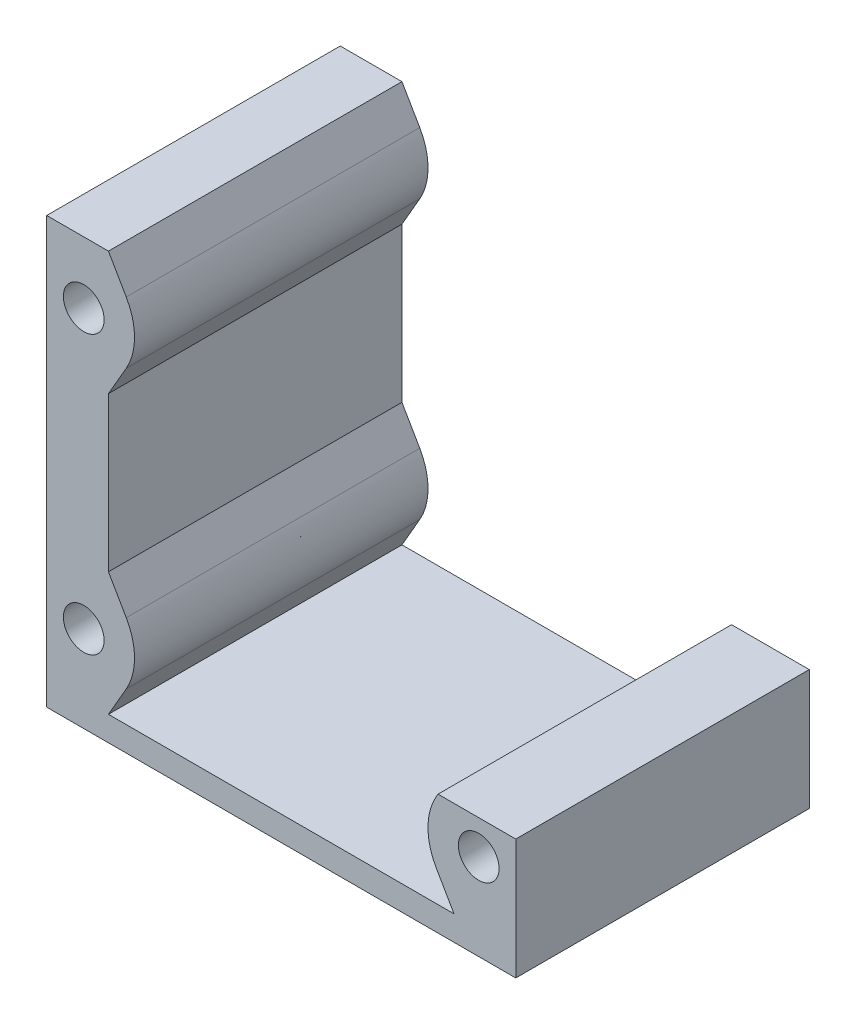
ISO-10303-21;
HEADER;
FILE_DESCRIPTION(('STEP AP214'),'2;1');
FILE_NAME('part.step','',(''),(''),'','','');
FILE_SCHEMA(('AUTOMOTIVE_DESIGN { 1 0 10303 214 1 1 1 1 }'));
ENDSEC;
DATA;
#1=APPLICATION_CONTEXT('core data for automotive mechanical design processes');
#2=APPLICATION_PROTOCOL_DEFINITION('international standard','automotive_design',2000,#1);
#3=PRODUCT_CONTEXT('',#1,'mechanical');
#4=PRODUCT('Part','Part','',(#3));
#5=PRODUCT_RELATED_PRODUCT_CATEGORY('part','',(#4));
#6=PRODUCT_DEFINITION_FORMATION('','',#4);
#7=PRODUCT_DEFINITION_CONTEXT('part definition',#1,'design');
#8=PRODUCT_DEFINITION('design','',#6,#7);
#9=PRODUCT_DEFINITION_SHAPE('','',#8);
#10=(LENGTH_UNIT() NAMED_UNIT(*) SI_UNIT(.MILLI.,.METRE.));
#11=(NAMED_UNIT(*) PLANE_ANGLE_UNIT() SI_UNIT($,.RADIAN.));
#12=(NAMED_UNIT(*) SI_UNIT($,.STERADIAN.) SOLID_ANGLE_UNIT());
#13=UNCERTAINTY_MEASURE_WITH_UNIT(LENGTH_MEASURE(1.E-05),#10,'distance_accuracy_value','');
#14=(GEOMETRIC_REPRESENTATION_CONTEXT(3) GLOBAL_UNCERTAINTY_ASSIGNED_CONTEXT((#13)) GLOBAL_UNIT_ASSIGNED_CONTEXT((#10,
#11,#12)) REPRESENTATION_CONTEXT('',''));
#15=CARTESIAN_POINT('',(0.,0.,0.));
#16=DIRECTION('',(0.,0.,1.));
#17=DIRECTION('',(1.,0.,0.));
#18=AXIS2_PLACEMENT_3D('',#15,#16,#17);
#19=CARTESIAN_POINT('',(85.7252959413938,-3.99999999999999,70.0573745353297));
#20=DIRECTION('',(0.,0.,1.));
#21=DIRECTION('',(1.,0.,0.));
#22=AXIS2_PLACEMENT_3D('',#19,#20,#21);
#23=PLANE('',#22);
#24=CARTESIAN_POINT('',(32.,10.,70.0573745353297));
#25=DIRECTION('',(0.,0.,1.));
#26=DIRECTION('',(1.,0.,0.));
#27=AXIS2_PLACEMENT_3D('',#24,#25,#26);
#28=CIRCLE('',#27,3.3);
#29=CARTESIAN_POINT('',(35.3,10.,70.0573745353297));
#30=VERTEX_POINT('',#29);
#31=EDGE_CURVE('E173',#30,#30,#28,.F.);
#32=ORIENTED_EDGE('',*,*,#31,.T.);
#33=EDGE_LOOP('',(#32));
#34=FACE_BOUND('',#33,.T.);
#35=CARTESIAN_POINT('',(-32.,55.,70.0573745353297));
#36=DIRECTION('',(0.,0.,1.));
#37=DIRECTION('',(1.,0.,0.));
#38=AXIS2_PLACEMENT_3D('',#35,#36,#37);
#39=CIRCLE('',#38,3.3);
#40=CARTESIAN_POINT('',(-28.7,55.,70.0573745353297));
#41=VERTEX_POINT('',#40);
#42=EDGE_CURVE('E169',#41,#41,#39,.F.);
#43=ORIENTED_EDGE('',*,*,#42,.T.);
#44=EDGE_LOOP('',(#43));
#45=FACE_BOUND('',#44,.T.);
#46=CARTESIAN_POINT('',(-32.,10.,70.0573745353297));
#47=DIRECTION('',(0.,0.,1.));
#48=DIRECTION('',(1.,0.,0.));
#49=AXIS2_PLACEMENT_3D('',#46,#47,#48);
#50=CIRCLE('',#49,3.3);
#51=CARTESIAN_POINT('',(-28.7,10.,70.0573745353297));
#52=VERTEX_POINT('',#51);
#53=EDGE_CURVE('E172',#52,#52,#50,.F.);
#54=ORIENTED_EDGE('',*,*,#53,.T.);
#55=EDGE_LOOP('',(#54));
#56=FACE_BOUND('',#55,.T.);
#57=DIRECTION('',(0.,-1.,0.));
#58=VECTOR('',#57,1.);
#59=CARTESIAN_POINT('',(38.,-3.99999999999999,70.0573745353297));
#60=LINE('',#59,#58);
#61=CARTESIAN_POINT('',(38.,15.5,70.0573745353297));
#62=VERTEX_POINT('',#61);
#63=CARTESIAN_POINT('',(38.,-3.99999999999999,70.0573745353297));
#64=VERTEX_POINT('',#63);
#65=EDGE_CURVE('E155',#62,#64,#60,.T.);
#66=ORIENTED_EDGE('',*,*,#65,.F.);
#67=DIRECTION('',(1.,0.,0.));
#68=VECTOR('',#67,1.);
#69=CARTESIAN_POINT('',(7.99999999999999,15.5,70.0573745353297));
#70=LINE('',#69,#68);
#71=CARTESIAN_POINT('',(25.4019237886467,15.5,70.0573745353297));
#72=VERTEX_POINT('',#71);
#73=EDGE_CURVE('E11',#72,#62,#70,.T.);
#74=ORIENTED_EDGE('',*,*,#73,.F.);
#75=DIRECTION('',(-0.5,-0.866025403784439,0.));
#76=VECTOR('',#75,1.);
#77=CARTESIAN_POINT('',(22.2264973081037,9.99999999999999,70.0573745353297));
#78=LINE('',#77,#76);
#79=CARTESIAN_POINT('',(25.1132486540519,15.,70.0573745353297));
#80=VERTEX_POINT('',#79);
#81=EDGE_CURVE('E188',#72,#80,#78,.T.);
#82=ORIENTED_EDGE('',*,*,#81,.T.);
#83=CARTESIAN_POINT('',(33.7735026918963,10.,70.0573745353297));
#84=DIRECTION('',(0.,0.,1.));
#85=DIRECTION('',(1.,0.,0.));
#86=AXIS2_PLACEMENT_3D('',#83,#84,#85);
#87=CIRCLE('',#86,10.);
#88=CARTESIAN_POINT('',(25.1132486540519,5.,70.0573745353297));
#89=VERTEX_POINT('',#88);
#90=EDGE_CURVE('E195',#80,#89,#87,.T.);
#91=ORIENTED_EDGE('',*,*,#90,.T.);
#92=DIRECTION('',(0.5,-0.866025403784438,0.));
#93=VECTOR('',#92,1.);
#94=CARTESIAN_POINT('',(28.,0.,70.0573745353297));
#95=LINE('',#94,#93);
#96=CARTESIAN_POINT('',(28.,0.,70.0573745353298));
#97=VERTEX_POINT('',#96);
#98=EDGE_CURVE('E196',#89,#97,#95,.T.);
#99=ORIENTED_EDGE('',*,*,#98,.T.);
#100=DIRECTION('',(-1.,0.,0.));
#101=VECTOR('',#100,1.);
#102=CARTESIAN_POINT('',(85.7252959413938,0.,70.0573745353297));
#103=LINE('',#102,#101);
#104=CARTESIAN_POINT('',(-28.,0.,70.0573745353297));
#105=VERTEX_POINT('',#104);
#106=EDGE_CURVE('E198',#97,#105,#103,.T.);
#107=ORIENTED_EDGE('',*,*,#106,.T.);
#108=DIRECTION('',(0.5,0.866025403784438,0.));
#109=VECTOR('',#108,1.);
#110=CARTESIAN_POINT('',(-28.,0.,70.0573745353298));
#111=LINE('',#110,#109);
#112=CARTESIAN_POINT('',(-25.1132486540519,5.,70.0573745353298));
#113=VERTEX_POINT('',#112);
#114=EDGE_CURVE('E235',#105,#113,#111,.T.);
#115=ORIENTED_EDGE('',*,*,#114,.T.);
#116=CARTESIAN_POINT('',(-33.7735026918963,10.,70.0573745353297));
#117=DIRECTION('',(0.,0.,1.));
#118=DIRECTION('',(1.,0.,0.));
#119=AXIS2_PLACEMENT_3D('',#116,#117,#118);
#120=CIRCLE('',#119,10.);
#121=CARTESIAN_POINT('',(-25.1132486540519,15.,70.0573745353297));
#122=VERTEX_POINT('',#121);
#123=EDGE_CURVE('E234',#113,#122,#120,.T.);
#124=ORIENTED_EDGE('',*,*,#123,.T.);
#125=DIRECTION('',(-0.5,0.866025403784439,0.));
#126=VECTOR('',#125,1.);
#127=CARTESIAN_POINT('',(-22.2264973081037,9.99999999999999,70.0573745353297));
#128=LINE('',#127,#126);
#129=CARTESIAN_POINT('',(-28.,20.,70.0573745353297));
#130=VERTEX_POINT('',#129);
#131=EDGE_CURVE('E232',#122,#130,#128,.T.);
#132=ORIENTED_EDGE('',*,*,#131,.T.);
#133=DIRECTION('',(0.,1.,0.));
#134=VECTOR('',#133,1.);
#135=CARTESIAN_POINT('',(-28.,20.,70.0573745353297));
#136=LINE('',#135,#134);
#137=CARTESIAN_POINT('',(-28.,45.,70.0573745353297));
#138=VERTEX_POINT('',#137);
#139=EDGE_CURVE('E229',#130,#138,#136,.T.);
#140=ORIENTED_EDGE('',*,*,#139,.T.);
#141=DIRECTION('',(0.5,0.866025403784439,0.));
#142=VECTOR('',#141,1.);
#143=CARTESIAN_POINT('',(-28.,45.,70.0573745353297));
#144=LINE('',#143,#142);
#145=CARTESIAN_POINT('',(-25.1132486540519,50.,70.0573745353297));
#146=VERTEX_POINT('',#145);
#147=EDGE_CURVE('E225',#138,#146,#144,.T.);
#148=ORIENTED_EDGE('',*,*,#147,.T.);
#149=CARTESIAN_POINT('',(-33.7735026918963,55.,70.0573745353297));
#150=DIRECTION('',(0.,0.,1.));
#151=DIRECTION('',(1.,0.,0.));
#152=AXIS2_PLACEMENT_3D('',#149,#150,#151);
#153=CIRCLE('',#152,10.);
#154=CARTESIAN_POINT('',(-25.1132486540519,60.,70.0573745353297));
#155=VERTEX_POINT('',#154);
#156=EDGE_CURVE('E228',#146,#155,#153,.T.);
#157=ORIENTED_EDGE('',*,*,#156,.T.);
#158=DIRECTION('',(-0.5,0.866025403784439,0.));
#159=VECTOR('',#158,1.);
#160=CARTESIAN_POINT('',(-22.2264973081037,55.,70.0573745353297));
#161=LINE('',#160,#159);
#162=CARTESIAN_POINT('',(-28.,65.,70.0573745353297));
#163=VERTEX_POINT('',#162);
#164=EDGE_CURVE('E240',#155,#163,#161,.T.);
#165=ORIENTED_EDGE('',*,*,#164,.T.);
#166=DIRECTION('',(-1.,0.,0.));
#167=VECTOR('',#166,1.);
#168=CARTESIAN_POINT('',(-28.,65.,70.0573745353297));
#169=LINE('',#168,#167);
#170=CARTESIAN_POINT('',(-38.,65.,70.0573745353297));
#171=VERTEX_POINT('',#170);
#172=EDGE_CURVE('E168',#163,#171,#169,.T.);
#173=ORIENTED_EDGE('',*,*,#172,.T.);
#174=DIRECTION('',(0.,1.,0.));
#175=VECTOR('',#174,1.);
#176=CARTESIAN_POINT('',(-38.,-3.99999999999999,70.0573745353297));
#177=LINE('',#176,#175);
#178=CARTESIAN_POINT('',(-38.,-3.99999999999999,70.0573745353297));
#179=VERTEX_POINT('',#178);
#180=EDGE_CURVE('E246',#179,#171,#177,.T.);
#181=ORIENTED_EDGE('',*,*,#180,.F.);
#182=DIRECTION('',(-1.,0.,0.));
#183=VECTOR('',#182,1.);
#184=CARTESIAN_POINT('',(85.7252959413938,-3.99999999999999,70.0573745353297));
#185=LINE('',#184,#183);
#186=EDGE_CURVE('E162',#64,#179,#185,.T.);
#187=ORIENTED_EDGE('',*,*,#186,.F.);
#188=EDGE_LOOP('',(#66,#74,#82,#91,#99,#107,#115,#124,#132,#140,#148,#157,#165,#173,#181,#187));
#189=FACE_BOUND('',#188,.T.);
#190=ADVANCED_FACE('F39',(#34,#45,#56,#189),#23,.T.);
#191=CARTESIAN_POINT('',(85.7252959413938,-4.,22.5));
#192=DIRECTION('',(0.,0.,-1.));
#193=DIRECTION('',(-1.,0.,0.));
#194=AXIS2_PLACEMENT_3D('',#191,#192,#193);
#195=PLANE('',#194);
#196=CARTESIAN_POINT('',(32.,10.,22.5));
#197=DIRECTION('',(0.,0.,-1.));
#198=DIRECTION('',(-1.,0.,0.));
#199=AXIS2_PLACEMENT_3D('',#196,#197,#198);
#200=CIRCLE('',#199,3.3);
#201=CARTESIAN_POINT('',(28.7,10.,22.5));
#202=VERTEX_POINT('',#201);
#203=EDGE_CURVE('E177',#202,#202,#200,.T.);
#204=ORIENTED_EDGE('',*,*,#203,.F.);
#205=EDGE_LOOP('',(#204));
#206=FACE_BOUND('',#205,.T.);
#207=CARTESIAN_POINT('',(-32.,55.,22.5));
#208=DIRECTION('',(0.,0.,-1.));
#209=DIRECTION('',(-1.,0.,0.));
#210=AXIS2_PLACEMENT_3D('',#207,#208,#209);
#211=CIRCLE('',#210,3.3);
#212=CARTESIAN_POINT('',(-35.3,55.,22.5));
#213=VERTEX_POINT('',#212);
#214=EDGE_CURVE('E174',#213,#213,#211,.T.);
#215=ORIENTED_EDGE('',*,*,#214,.F.);
#216=EDGE_LOOP('',(#215));
#217=FACE_BOUND('',#216,.T.);
#218=CARTESIAN_POINT('',(-32.,10.,22.5));
#219=DIRECTION('',(0.,0.,-1.));
#220=DIRECTION('',(-1.,0.,0.));
#221=AXIS2_PLACEMENT_3D('',#218,#219,#220);
#222=CIRCLE('',#221,3.3);
#223=CARTESIAN_POINT('',(-35.3,10.,22.5));
#224=VERTEX_POINT('',#223);
#225=EDGE_CURVE('E178',#224,#224,#222,.T.);
#226=ORIENTED_EDGE('',*,*,#225,.F.);
#227=EDGE_LOOP('',(#226));
#228=FACE_BOUND('',#227,.T.);
#229=DIRECTION('',(-0.5,-0.866025403784439,0.));
#230=VECTOR('',#229,1.);
#231=CARTESIAN_POINT('',(22.2264973081038,10.,22.5));
#232=LINE('',#231,#230);
#233=CARTESIAN_POINT('',(25.4019237886467,15.5,22.5));
#234=VERTEX_POINT('',#233);
#235=CARTESIAN_POINT('',(25.1132486540519,15.,22.5));
#236=VERTEX_POINT('',#235);
#237=EDGE_CURVE('E199',#234,#236,#232,.T.);
#238=ORIENTED_EDGE('',*,*,#237,.F.);
#239=DIRECTION('',(1.,0.,0.));
#240=VECTOR('',#239,1.);
#241=CARTESIAN_POINT('',(7.99999999999999,15.5,22.5000000000001));
#242=LINE('',#241,#240);
#243=CARTESIAN_POINT('',(38.,15.5,22.5000000000001));
#244=VERTEX_POINT('',#243);
#245=EDGE_CURVE('E56',#234,#244,#242,.T.);
#246=ORIENTED_EDGE('',*,*,#245,.T.);
#247=DIRECTION('',(0.,1.,0.));
#248=VECTOR('',#247,1.);
#249=CARTESIAN_POINT('',(38.,-3.99999999999999,22.5));
#250=LINE('',#249,#248);
#251=CARTESIAN_POINT('',(38.,-4.,22.5));
#252=VERTEX_POINT('',#251);
#253=EDGE_CURVE('E42',#252,#244,#250,.T.);
#254=ORIENTED_EDGE('',*,*,#253,.F.);
#255=DIRECTION('',(-1.,0.,0.));
#256=VECTOR('',#255,1.);
#257=CARTESIAN_POINT('',(85.7252959413938,-4.,22.5));
#258=LINE('',#257,#256);
#259=CARTESIAN_POINT('',(-38.,-4.,22.5));
#260=VERTEX_POINT('',#259);
#261=EDGE_CURVE('E167',#252,#260,#258,.T.);
#262=ORIENTED_EDGE('',*,*,#261,.T.);
#263=DIRECTION('',(0.,-1.,0.));
#264=VECTOR('',#263,1.);
#265=CARTESIAN_POINT('',(-38.,-4.,22.5));
#266=LINE('',#265,#264);
#267=CARTESIAN_POINT('',(-38.,65.,22.5));
#268=VERTEX_POINT('',#267);
#269=EDGE_CURVE('E245',#268,#260,#266,.T.);
#270=ORIENTED_EDGE('',*,*,#269,.F.);
#271=DIRECTION('',(-1.,0.,0.));
#272=VECTOR('',#271,1.);
#273=CARTESIAN_POINT('',(-28.,65.,22.5));
#274=LINE('',#273,#272);
#275=CARTESIAN_POINT('',(-28.,65.,22.5));
#276=VERTEX_POINT('',#275);
#277=EDGE_CURVE('E221',#276,#268,#274,.T.);
#278=ORIENTED_EDGE('',*,*,#277,.F.);
#279=DIRECTION('',(-0.5,0.866025403784439,0.));
#280=VECTOR('',#279,1.);
#281=CARTESIAN_POINT('',(-22.2264973081038,55.,22.5));
#282=LINE('',#281,#280);
#283=CARTESIAN_POINT('',(-25.1132486540519,60.,22.5));
#284=VERTEX_POINT('',#283);
#285=EDGE_CURVE('E203',#284,#276,#282,.T.);
#286=ORIENTED_EDGE('',*,*,#285,.F.);
#287=CARTESIAN_POINT('',(-33.7735026918963,55.,22.5));
#288=DIRECTION('',(0.,0.,-1.));
#289=DIRECTION('',(-1.,0.,0.));
#290=AXIS2_PLACEMENT_3D('',#287,#288,#289);
#291=CIRCLE('',#290,10.);
#292=CARTESIAN_POINT('',(-25.1132486540519,50.,22.5));
#293=VERTEX_POINT('',#292);
#294=EDGE_CURVE('E264',#284,#293,#291,.T.);
#295=ORIENTED_EDGE('',*,*,#294,.T.);
#296=DIRECTION('',(0.499999999999999,0.866025403784439,0.));
#297=VECTOR('',#296,1.);
#298=CARTESIAN_POINT('',(-28.,45.,22.5));
#299=LINE('',#298,#297);
#300=CARTESIAN_POINT('',(-28.,45.,22.5));
#301=VERTEX_POINT('',#300);
#302=EDGE_CURVE('E206',#301,#293,#299,.T.);
#303=ORIENTED_EDGE('',*,*,#302,.F.);
#304=DIRECTION('',(0.,1.,0.));
#305=VECTOR('',#304,1.);
#306=CARTESIAN_POINT('',(-28.,20.,22.5));
#307=LINE('',#306,#305);
#308=CARTESIAN_POINT('',(-28.,20.,22.5));
#309=VERTEX_POINT('',#308);
#310=EDGE_CURVE('E210',#309,#301,#307,.T.);
#311=ORIENTED_EDGE('',*,*,#310,.F.);
#312=DIRECTION('',(-0.5,0.866025403784439,0.));
#313=VECTOR('',#312,1.);
#314=CARTESIAN_POINT('',(-22.2264973081038,10.,22.5));
#315=LINE('',#314,#313);
#316=CARTESIAN_POINT('',(-25.1132486540519,15.,22.5));
#317=VERTEX_POINT('',#316);
#318=EDGE_CURVE('E214',#317,#309,#315,.T.);
#319=ORIENTED_EDGE('',*,*,#318,.F.);
#320=CARTESIAN_POINT('',(-33.7735026918963,10.,22.5));
#321=DIRECTION('',(0.,0.,-1.));
#322=DIRECTION('',(-1.,0.,0.));
#323=AXIS2_PLACEMENT_3D('',#320,#321,#322);
#324=CIRCLE('',#323,10.);
#325=CARTESIAN_POINT('',(-25.1132486540519,5.,22.5));
#326=VERTEX_POINT('',#325);
#327=EDGE_CURVE('E270',#317,#326,#324,.T.);
#328=ORIENTED_EDGE('',*,*,#327,.T.);
#329=DIRECTION('',(0.5,0.866025403784438,0.));
#330=VECTOR('',#329,1.);
#331=CARTESIAN_POINT('',(-28.,0.,22.5));
#332=LINE('',#331,#330);
#333=CARTESIAN_POINT('',(-28.,0.,22.5));
#334=VERTEX_POINT('',#333);
#335=EDGE_CURVE('E217',#334,#326,#332,.T.);
#336=ORIENTED_EDGE('',*,*,#335,.F.);
#337=DIRECTION('',(-1.,0.,0.));
#338=VECTOR('',#337,1.);
#339=CARTESIAN_POINT('',(85.7252959413938,0.,22.5));
#340=LINE('',#339,#338);
#341=CARTESIAN_POINT('',(28.,0.,22.5));
#342=VERTEX_POINT('',#341);
#343=EDGE_CURVE('E192',#342,#334,#340,.T.);
#344=ORIENTED_EDGE('',*,*,#343,.F.);
#345=DIRECTION('',(0.5,-0.866025403784438,0.));
#346=VECTOR('',#345,1.);
#347=CARTESIAN_POINT('',(28.,0.,22.5));
#348=LINE('',#347,#346);
#349=CARTESIAN_POINT('',(25.1132486540519,5.,22.5));
#350=VERTEX_POINT('',#349);
#351=EDGE_CURVE('E185',#350,#342,#348,.T.);
#352=ORIENTED_EDGE('',*,*,#351,.F.);
#353=CARTESIAN_POINT('',(33.7735026918963,10.,22.5));
#354=DIRECTION('',(0.,0.,-1.));
#355=DIRECTION('',(-1.,0.,0.));
#356=AXIS2_PLACEMENT_3D('',#353,#354,#355);
#357=CIRCLE('',#356,10.);
#358=EDGE_CURVE('E158',#350,#236,#357,.T.);
#359=ORIENTED_EDGE('',*,*,#358,.T.);
#360=EDGE_LOOP('',(#238,#246,#254,#262,#270,#278,#286,#295,#303,#311,#319,#328,#336,#344,#352,#359));
#361=FACE_BOUND('',#360,.T.);
#362=ADVANCED_FACE('F303',(#206,#217,#228,#361),#195,.T.);
#363=CARTESIAN_POINT('',(38.,0.,92.5573745353298));
#364=DIRECTION('',(-1.,0.,0.));
#365=DIRECTION('',(0.,0.,1.));
#366=AXIS2_PLACEMENT_3D('',#363,#364,#365);
#367=PLANE('',#366);
#368=DIRECTION('',(0.,0.,1.));
#369=VECTOR('',#368,1.);
#370=CARTESIAN_POINT('',(38.,15.5,22.5000000000001));
#371=LINE('',#370,#369);
#372=EDGE_CURVE('E148',#244,#62,#371,.T.);
#373=ORIENTED_EDGE('',*,*,#372,.T.);
#374=ORIENTED_EDGE('',*,*,#65,.T.);
#375=DIRECTION('',(0.,0.,-1.));
#376=VECTOR('',#375,1.);
#377=CARTESIAN_POINT('',(38.,-3.99999999999999,70.0573745353297));
#378=LINE('',#377,#376);
#379=EDGE_CURVE('E163',#64,#252,#378,.T.);
#380=ORIENTED_EDGE('',*,*,#379,.T.);
#381=ORIENTED_EDGE('',*,*,#253,.T.);
#382=EDGE_LOOP('',(#373,#374,#380,#381));
#383=FACE_BOUND('',#382,.T.);
#384=ADVANCED_FACE('F154',(#383),#367,.F.);
#385=CARTESIAN_POINT('',(22.2264973081038,10.,136.943870834443));
#386=DIRECTION('',(0.866025403784439,-0.5,0.));
#387=DIRECTION('',(0.5,0.866025403784439,0.));
#388=AXIS2_PLACEMENT_3D('',#385,#386,#387);
#389=PLANE('',#388);
#390=DIRECTION('',(0.,0.,1.));
#391=VECTOR('',#390,1.);
#392=CARTESIAN_POINT('',(25.4019237886467,15.5,136.943870834443));
#393=LINE('',#392,#391);
#394=EDGE_CURVE('E48',#234,#72,#393,.T.);
#395=ORIENTED_EDGE('',*,*,#394,.F.);
#396=ORIENTED_EDGE('',*,*,#237,.T.);
#397=DIRECTION('',(0.,0.,-1.));
#398=VECTOR('',#397,1.);
#399=CARTESIAN_POINT('',(25.1132486540519,15.,136.943870834443));
#400=LINE('',#399,#398);
#401=EDGE_CURVE('E193',#236,#80,#400,.F.);
#402=ORIENTED_EDGE('',*,*,#401,.T.);
#403=ORIENTED_EDGE('',*,*,#81,.F.);
#404=EDGE_LOOP('',(#395,#396,#402,#403));
#405=FACE_BOUND('',#404,.T.);
#406=ADVANCED_FACE('F317',(#405),#389,.F.);
#407=CARTESIAN_POINT('',(85.7252959413938,0.,70.0573745353297));
#408=DIRECTION('',(0.,1.,0.));
#409=DIRECTION('',(0.,0.,1.));
#410=AXIS2_PLACEMENT_3D('',#407,#408,#409);
#411=PLANE('',#410);
#412=ORIENTED_EDGE('',*,*,#106,.F.);
#413=DIRECTION('',(0.,0.,-1.));
#414=VECTOR('',#413,1.);
#415=CARTESIAN_POINT('',(28.,0.,136.943870834443));
#416=LINE('',#415,#414);
#417=EDGE_CURVE('E189',#97,#342,#416,.T.);
#418=ORIENTED_EDGE('',*,*,#417,.T.);
#419=ORIENTED_EDGE('',*,*,#343,.T.);
#420=DIRECTION('',(0.,0.,-1.));
#421=VECTOR('',#420,1.);
#422=CARTESIAN_POINT('',(-28.,0.,136.943870834443));
#423=LINE('',#422,#421);
#424=EDGE_CURVE('E247',#105,#334,#423,.T.);
#425=ORIENTED_EDGE('',*,*,#424,.F.);
#426=EDGE_LOOP('',(#412,#418,#419,#425));
#427=FACE_BOUND('',#426,.T.);
#428=ADVANCED_FACE('F374',(#427),#411,.T.);
#429=CARTESIAN_POINT('',(85.7252959413938,-3.99999999999999,70.0573745353297));
#430=DIRECTION('',(0.,-1.,0.));
#431=DIRECTION('',(0.,0.,-1.));
#432=AXIS2_PLACEMENT_3D('',#429,#430,#431);
#433=PLANE('',#432);
#434=ORIENTED_EDGE('',*,*,#379,.F.);
#435=ORIENTED_EDGE('',*,*,#186,.T.);
#436=DIRECTION('',(0.,0.,1.));
#437=VECTOR('',#436,1.);
#438=CARTESIAN_POINT('',(-38.,-3.99999999999999,70.0573745353297));
#439=LINE('',#438,#437);
#440=EDGE_CURVE('E255',#260,#179,#439,.T.);
#441=ORIENTED_EDGE('',*,*,#440,.F.);
#442=ORIENTED_EDGE('',*,*,#261,.F.);
#443=EDGE_LOOP('',(#434,#435,#441,#442));
#444=FACE_BOUND('',#443,.T.);
#445=ADVANCED_FACE('F313',(#444),#433,.T.);
#446=CARTESIAN_POINT('',(-38.,0.,0.));
#447=DIRECTION('',(-1.,0.,0.));
#448=DIRECTION('',(0.,0.,1.));
#449=AXIS2_PLACEMENT_3D('',#446,#447,#448);
#450=PLANE('',#449);
#451=ORIENTED_EDGE('',*,*,#180,.T.);
#452=DIRECTION('',(0.,0.,-1.));
#453=VECTOR('',#452,1.);
#454=CARTESIAN_POINT('',(-38.,65.,136.943870834443));
#455=LINE('',#454,#453);
#456=EDGE_CURVE('E242',#171,#268,#455,.T.);
#457=ORIENTED_EDGE('',*,*,#456,.T.);
#458=ORIENTED_EDGE('',*,*,#269,.T.);
#459=ORIENTED_EDGE('',*,*,#440,.T.);
#460=EDGE_LOOP('',(#451,#457,#458,#459));
#461=FACE_BOUND('',#460,.T.);
#462=ADVANCED_FACE('F310',(#461),#450,.T.);
#463=CARTESIAN_POINT('',(-28.,65.,136.943870834443));
#464=DIRECTION('',(0.,-1.,0.));
#465=DIRECTION('',(0.,0.,-1.));
#466=AXIS2_PLACEMENT_3D('',#463,#464,#465);
#467=PLANE('',#466);
#468=ORIENTED_EDGE('',*,*,#172,.F.);
#469=DIRECTION('',(0.,0.,-1.));
#470=VECTOR('',#469,1.);
#471=CARTESIAN_POINT('',(-28.,65.,136.943870834443));
#472=LINE('',#471,#470);
#473=EDGE_CURVE('E224',#163,#276,#472,.T.);
#474=ORIENTED_EDGE('',*,*,#473,.T.);
#475=ORIENTED_EDGE('',*,*,#277,.T.);
#476=ORIENTED_EDGE('',*,*,#456,.F.);
#477=EDGE_LOOP('',(#468,#474,#475,#476));
#478=FACE_BOUND('',#477,.T.);
#479=ADVANCED_FACE('F307',(#478),#467,.F.);
#480=CARTESIAN_POINT('',(-28.,0.,136.943870834443));
#481=DIRECTION('',(-0.866025403784438,0.5,0.));
#482=DIRECTION('',(-0.5,-0.866025403784438,0.));
#483=AXIS2_PLACEMENT_3D('',#480,#481,#482);
#484=PLANE('',#483);
#485=ORIENTED_EDGE('',*,*,#335,.T.);
#486=DIRECTION('',(0.,0.,-1.));
#487=VECTOR('',#486,1.);
#488=CARTESIAN_POINT('',(-25.1132486540519,5.,136.943870834443));
#489=LINE('',#488,#487);
#490=EDGE_CURVE('E220',#326,#113,#489,.F.);
#491=ORIENTED_EDGE('',*,*,#490,.T.);
#492=ORIENTED_EDGE('',*,*,#114,.F.);
#493=ORIENTED_EDGE('',*,*,#424,.T.);
#494=EDGE_LOOP('',(#485,#491,#492,#493));
#495=FACE_BOUND('',#494,.T.);
#496=ADVANCED_FACE('F388',(#495),#484,.F.);
#497=CARTESIAN_POINT('',(-22.2264973081038,10.,136.943870834443));
#498=DIRECTION('',(-0.866025403784439,-0.5,0.));
#499=DIRECTION('',(0.5,-0.866025403784439,0.));
#500=AXIS2_PLACEMENT_3D('',#497,#498,#499);
#501=PLANE('',#500);
#502=ORIENTED_EDGE('',*,*,#131,.F.);
#503=DIRECTION('',(0.,0.,-1.));
#504=VECTOR('',#503,1.);
#505=CARTESIAN_POINT('',(-25.1132486540519,15.,136.943870834443));
#506=LINE('',#505,#504);
#507=EDGE_CURVE('E216',#122,#317,#506,.T.);
#508=ORIENTED_EDGE('',*,*,#507,.T.);
#509=ORIENTED_EDGE('',*,*,#318,.T.);
#510=DIRECTION('',(0.,0.,-1.));
#511=VECTOR('',#510,1.);
#512=CARTESIAN_POINT('',(-28.,20.,136.943870834443));
#513=LINE('',#512,#511);
#514=EDGE_CURVE('E213',#130,#309,#513,.T.);
#515=ORIENTED_EDGE('',*,*,#514,.F.);
#516=EDGE_LOOP('',(#502,#508,#509,#515));
#517=FACE_BOUND('',#516,.T.);
#518=ADVANCED_FACE('F391',(#517),#501,.F.);
#519=CARTESIAN_POINT('',(-28.,20.,136.943870834443));
#520=DIRECTION('',(-1.,0.,0.));
#521=DIRECTION('',(0.,-1.,0.));
#522=AXIS2_PLACEMENT_3D('',#519,#520,#521);
#523=PLANE('',#522);
#524=ORIENTED_EDGE('',*,*,#139,.F.);
#525=ORIENTED_EDGE('',*,*,#514,.T.);
#526=ORIENTED_EDGE('',*,*,#310,.T.);
#527=DIRECTION('',(0.,0.,-1.));
#528=VECTOR('',#527,1.);
#529=CARTESIAN_POINT('',(-28.,45.,136.943870834443));
#530=LINE('',#529,#528);
#531=EDGE_CURVE('E252',#138,#301,#530,.T.);
#532=ORIENTED_EDGE('',*,*,#531,.F.);
#533=EDGE_LOOP('',(#524,#525,#526,#532));
#534=FACE_BOUND('',#533,.T.);
#535=ADVANCED_FACE('F395',(#534),#523,.F.);
#536=CARTESIAN_POINT('',(-28.,45.,136.943870834443));
#537=DIRECTION('',(-0.866025403784439,0.499999999999999,0.));
#538=DIRECTION('',(-0.5,-0.866025403784439,0.));
#539=AXIS2_PLACEMENT_3D('',#536,#537,#538);
#540=PLANE('',#539);
#541=ORIENTED_EDGE('',*,*,#302,.T.);
#542=DIRECTION('',(0.,0.,-1.));
#543=VECTOR('',#542,1.);
#544=CARTESIAN_POINT('',(-25.1132486540519,50.,136.943870834443));
#545=LINE('',#544,#543);
#546=EDGE_CURVE('E209',#293,#146,#545,.F.);
#547=ORIENTED_EDGE('',*,*,#546,.T.);
#548=ORIENTED_EDGE('',*,*,#147,.F.);
#549=ORIENTED_EDGE('',*,*,#531,.T.);
#550=EDGE_LOOP('',(#541,#547,#548,#549));
#551=FACE_BOUND('',#550,.T.);
#552=ADVANCED_FACE('F287',(#551),#540,.F.);
#553=CARTESIAN_POINT('',(-22.2264973081038,55.,136.943870834443));
#554=DIRECTION('',(-0.866025403784439,-0.5,0.));
#555=DIRECTION('',(0.5,-0.866025403784439,0.));
#556=AXIS2_PLACEMENT_3D('',#553,#554,#555);
#557=PLANE('',#556);
#558=ORIENTED_EDGE('',*,*,#164,.F.);
#559=DIRECTION('',(0.,0.,-1.));
#560=VECTOR('',#559,1.);
#561=CARTESIAN_POINT('',(-25.1132486540519,60.,136.943870834443));
#562=LINE('',#561,#560);
#563=EDGE_CURVE('E205',#155,#284,#562,.T.);
#564=ORIENTED_EDGE('',*,*,#563,.T.);
#565=ORIENTED_EDGE('',*,*,#285,.T.);
#566=ORIENTED_EDGE('',*,*,#473,.F.);
#567=EDGE_LOOP('',(#558,#564,#565,#566));
#568=FACE_BOUND('',#567,.T.);
#569=ADVANCED_FACE('F298',(#568),#557,.F.);
#570=CARTESIAN_POINT('',(28.,0.,136.943870834443));
#571=DIRECTION('',(0.866025403784438,0.5,0.));
#572=DIRECTION('',(-0.5,0.866025403784438,0.));
#573=AXIS2_PLACEMENT_3D('',#570,#571,#572);
#574=PLANE('',#573);
#575=ORIENTED_EDGE('',*,*,#98,.F.);
#576=DIRECTION('',(0.,0.,-1.));
#577=VECTOR('',#576,1.);
#578=CARTESIAN_POINT('',(25.1132486540519,5.,136.943870834443));
#579=LINE('',#578,#577);
#580=EDGE_CURVE('E202',#89,#350,#579,.T.);
#581=ORIENTED_EDGE('',*,*,#580,.T.);
#582=ORIENTED_EDGE('',*,*,#351,.T.);
#583=ORIENTED_EDGE('',*,*,#417,.F.);
#584=EDGE_LOOP('',(#575,#581,#582,#583));
#585=FACE_BOUND('',#584,.T.);
#586=ADVANCED_FACE('F324',(#585),#574,.F.);
#587=CARTESIAN_POINT('',(33.7735026918963,10.,136.943870834443));
#588=DIRECTION('',(0.,0.,-1.));
#589=DIRECTION('',(-1.,0.,0.));
#590=AXIS2_PLACEMENT_3D('',#587,#588,#589);
#591=CYLINDRICAL_SURFACE('',#590,10.);
#592=ORIENTED_EDGE('',*,*,#90,.F.);
#593=ORIENTED_EDGE('',*,*,#401,.F.);
#594=ORIENTED_EDGE('',*,*,#358,.F.);
#595=ORIENTED_EDGE('',*,*,#580,.F.);
#596=EDGE_LOOP('',(#592,#593,#594,#595));
#597=FACE_BOUND('',#596,.T.);
#598=ADVANCED_FACE('F326',(#597),#591,.T.);
#599=CARTESIAN_POINT('',(-33.7735026918963,10.,136.943870834443));
#600=DIRECTION('',(0.,0.,-1.));
#601=DIRECTION('',(-1.,0.,0.));
#602=AXIS2_PLACEMENT_3D('',#599,#600,#601);
#603=CYLINDRICAL_SURFACE('',#602,10.);
#604=ORIENTED_EDGE('',*,*,#123,.F.);
#605=ORIENTED_EDGE('',*,*,#490,.F.);
#606=ORIENTED_EDGE('',*,*,#327,.F.);
#607=ORIENTED_EDGE('',*,*,#507,.F.);
#608=EDGE_LOOP('',(#604,#605,#606,#607));
#609=FACE_BOUND('',#608,.T.);
#610=ADVANCED_FACE('F328',(#609),#603,.T.);
#611=CARTESIAN_POINT('',(-33.7735026918963,55.,136.943870834443));
#612=DIRECTION('',(0.,0.,-1.));
#613=DIRECTION('',(-1.,0.,0.));
#614=AXIS2_PLACEMENT_3D('',#611,#612,#613);
#615=CYLINDRICAL_SURFACE('',#614,10.);
#616=ORIENTED_EDGE('',*,*,#156,.F.);
#617=ORIENTED_EDGE('',*,*,#546,.F.);
#618=ORIENTED_EDGE('',*,*,#294,.F.);
#619=ORIENTED_EDGE('',*,*,#563,.F.);
#620=EDGE_LOOP('',(#616,#617,#618,#619));
#621=FACE_BOUND('',#620,.T.);
#622=ADVANCED_FACE('F295',(#621),#615,.T.);
#623=CARTESIAN_POINT('',(-32.,10.,79.3911840469921));
#624=DIRECTION('',(0.,0.,-1.));
#625=DIRECTION('',(-1.,0.,0.));
#626=AXIS2_PLACEMENT_3D('',#623,#624,#625);
#627=CYLINDRICAL_SURFACE('',#626,3.3);
#628=ORIENTED_EDGE('',*,*,#225,.T.);
#629=EDGE_LOOP('',(#628));
#630=FACE_BOUND('',#629,.T.);
#631=ORIENTED_EDGE('',*,*,#53,.F.);
#632=EDGE_LOOP('',(#631));
#633=FACE_BOUND('',#632,.T.);
#634=ADVANCED_FACE('F350',(#630,#633),#627,.F.);
#635=CARTESIAN_POINT('',(-32.,55.,79.3911840469921));
#636=DIRECTION('',(0.,0.,-1.));
#637=DIRECTION('',(-1.,0.,0.));
#638=AXIS2_PLACEMENT_3D('',#635,#636,#637);
#639=CYLINDRICAL_SURFACE('',#638,3.3);
#640=ORIENTED_EDGE('',*,*,#214,.T.);
#641=EDGE_LOOP('',(#640));
#642=FACE_BOUND('',#641,.T.);
#643=ORIENTED_EDGE('',*,*,#42,.F.);
#644=EDGE_LOOP('',(#643));
#645=FACE_BOUND('',#644,.T.);
#646=ADVANCED_FACE('F352',(#642,#645),#639,.F.);
#647=CARTESIAN_POINT('',(32.,10.,79.3911840469921));
#648=DIRECTION('',(0.,0.,-1.));
#649=DIRECTION('',(-1.,0.,0.));
#650=AXIS2_PLACEMENT_3D('',#647,#648,#649);
#651=CYLINDRICAL_SURFACE('',#650,3.3);
#652=ORIENTED_EDGE('',*,*,#203,.T.);
#653=EDGE_LOOP('',(#652));
#654=FACE_BOUND('',#653,.T.);
#655=ORIENTED_EDGE('',*,*,#31,.F.);
#656=EDGE_LOOP('',(#655));
#657=FACE_BOUND('',#656,.T.);
#658=ADVANCED_FACE('F359',(#654,#657),#651,.F.);
#659=CARTESIAN_POINT('',(7.99999999999999,15.5,22.5000000000001));
#660=DIRECTION('',(0.,1.,0.));
#661=DIRECTION('',(-1.,0.,0.));
#662=AXIS2_PLACEMENT_3D('',#659,#660,#661);
#663=PLANE('',#662);
#664=ORIENTED_EDGE('',*,*,#394,.T.);
#665=ORIENTED_EDGE('',*,*,#73,.T.);
#666=ORIENTED_EDGE('',*,*,#372,.F.);
#667=ORIENTED_EDGE('',*,*,#245,.F.);
#668=EDGE_LOOP('',(#664,#665,#666,#667));
#669=FACE_BOUND('',#668,.T.);
#670=ADVANCED_FACE('F147',(#669),#663,.T.);
#671=CLOSED_SHELL('',(#190,#362,#384,#406,#428,#445,#462,#479,#496,#518,#535,#552,#569,#586,
#598,#610,#622,#634,#646,#658,#670));
#672=MANIFOLD_SOLID_BREP('B2',#671);
#673=ADVANCED_BREP_SHAPE_REPRESENTATION('',(#18,#672),#14);
#674=SHAPE_DEFINITION_REPRESENTATION(#9,#673);
ENDSEC;
END-ISO-10303-21;
